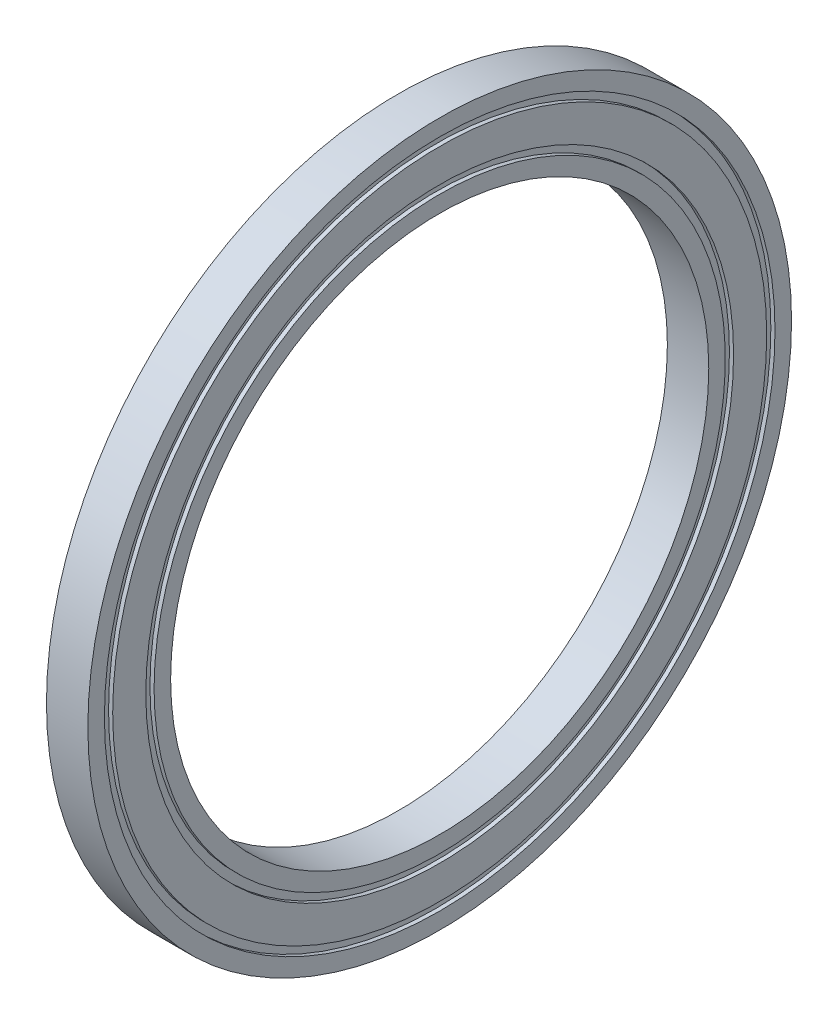
ISO-10303-21;
HEADER;
FILE_DESCRIPTION(('STEP AP214'),'2;1');
FILE_NAME('part.step','',(''),(''),'','','');
FILE_SCHEMA(('AUTOMOTIVE_DESIGN { 1 0 10303 214 1 1 1 1 }'));
ENDSEC;
DATA;
#1=APPLICATION_CONTEXT('core data for automotive mechanical design processes');
#2=APPLICATION_PROTOCOL_DEFINITION('international standard','automotive_design',2000,#1);
#3=PRODUCT_CONTEXT('',#1,'mechanical');
#4=PRODUCT('Part','Part','',(#3));
#5=PRODUCT_RELATED_PRODUCT_CATEGORY('part','',(#4));
#6=PRODUCT_DEFINITION_FORMATION('','',#4);
#7=PRODUCT_DEFINITION_CONTEXT('part definition',#1,'design');
#8=PRODUCT_DEFINITION('design','',#6,#7);
#9=PRODUCT_DEFINITION_SHAPE('','',#8);
#10=(LENGTH_UNIT() NAMED_UNIT(*) SI_UNIT(.MILLI.,.METRE.));
#11=(NAMED_UNIT(*) PLANE_ANGLE_UNIT() SI_UNIT($,.RADIAN.));
#12=(NAMED_UNIT(*) SI_UNIT($,.STERADIAN.) SOLID_ANGLE_UNIT());
#13=UNCERTAINTY_MEASURE_WITH_UNIT(LENGTH_MEASURE(1.E-05),#10,'distance_accuracy_value','');
#14=(GEOMETRIC_REPRESENTATION_CONTEXT(3) GLOBAL_UNCERTAINTY_ASSIGNED_CONTEXT((#13)) GLOBAL_UNIT_ASSIGNED_CONTEXT((#10,
#11,#12)) REPRESENTATION_CONTEXT('',''));
#15=CARTESIAN_POINT('',(0.,0.,0.));
#16=DIRECTION('',(0.,0.,1.));
#17=DIRECTION('',(1.,0.,0.));
#18=AXIS2_PLACEMENT_3D('',#15,#16,#17);
#19=CARTESIAN_POINT('',(2.,40.5,0.));
#20=DIRECTION('',(-1.,0.,0.));
#21=DIRECTION('',(0.,0.,1.));
#22=AXIS2_PLACEMENT_3D('',#19,#20,#21);
#23=PLANE('',#22);
#24=CARTESIAN_POINT('',(2.,0.,0.));
#25=DIRECTION('',(-1.,0.,0.));
#26=DIRECTION('',(0.,0.,1.));
#27=AXIS2_PLACEMENT_3D('',#24,#25,#26);
#28=CIRCLE('',#27,40.5);
#29=CARTESIAN_POINT('',(2.,0.,40.5));
#30=VERTEX_POINT('',#29);
#31=EDGE_CURVE('E10',#30,#30,#28,.T.);
#32=ORIENTED_EDGE('',*,*,#31,.F.);
#33=EDGE_LOOP('',(#32));
#34=FACE_BOUND('',#33,.T.);
#35=CARTESIAN_POINT('',(2.,0.,0.));
#36=DIRECTION('',(-1.,0.,0.));
#37=DIRECTION('',(0.,0.,1.));
#38=AXIS2_PLACEMENT_3D('',#35,#36,#37);
#39=CIRCLE('',#38,39.5);
#40=CARTESIAN_POINT('',(2.,0.,39.5));
#41=VERTEX_POINT('',#40);
#42=EDGE_CURVE('E107',#41,#41,#39,.T.);
#43=ORIENTED_EDGE('',*,*,#42,.T.);
#44=EDGE_LOOP('',(#43));
#45=FACE_BOUND('',#44,.T.);
#46=ADVANCED_FACE('F43',(#34,#45),#23,.F.);
#47=CARTESIAN_POINT('',(0.,0.,0.));
#48=DIRECTION('',(-1.,0.,0.));
#49=DIRECTION('',(0.,0.,1.));
#50=AXIS2_PLACEMENT_3D('',#47,#48,#49);
#51=CYLINDRICAL_SURFACE('',#50,40.5);
#52=CARTESIAN_POINT('',(2.5,0.,0.));
#53=DIRECTION('',(-1.,0.,0.));
#54=DIRECTION('',(0.,0.,1.));
#55=AXIS2_PLACEMENT_3D('',#52,#53,#54);
#56=CIRCLE('',#55,40.5);
#57=CARTESIAN_POINT('',(2.5,0.,40.5));
#58=VERTEX_POINT('',#57);
#59=EDGE_CURVE('E49',#58,#58,#56,.T.);
#60=ORIENTED_EDGE('',*,*,#59,.F.);
#61=EDGE_LOOP('',(#60));
#62=FACE_BOUND('',#61,.T.);
#63=ORIENTED_EDGE('',*,*,#31,.T.);
#64=EDGE_LOOP('',(#63));
#65=FACE_BOUND('',#64,.T.);
#66=ADVANCED_FACE('F216',(#62,#65),#51,.F.);
#67=CARTESIAN_POINT('',(2.5,42.5,0.));
#68=DIRECTION('',(-1.,0.,0.));
#69=DIRECTION('',(0.,0.,1.));
#70=AXIS2_PLACEMENT_3D('',#67,#68,#69);
#71=PLANE('',#70);
#72=CARTESIAN_POINT('',(2.5,0.,0.));
#73=DIRECTION('',(-1.,0.,0.));
#74=DIRECTION('',(0.,0.,1.));
#75=AXIS2_PLACEMENT_3D('',#72,#73,#74);
#76=CIRCLE('',#75,42.5);
#77=CARTESIAN_POINT('',(2.5,0.,42.5));
#78=VERTEX_POINT('',#77);
#79=EDGE_CURVE('E53',#78,#78,#76,.T.);
#80=ORIENTED_EDGE('',*,*,#79,.F.);
#81=EDGE_LOOP('',(#80));
#82=FACE_BOUND('',#81,.T.);
#83=ORIENTED_EDGE('',*,*,#59,.T.);
#84=EDGE_LOOP('',(#83));
#85=FACE_BOUND('',#84,.T.);
#86=ADVANCED_FACE('F211',(#82,#85),#71,.F.);
#87=CARTESIAN_POINT('',(0.,0.,0.));
#88=DIRECTION('',(-1.,0.,0.));
#89=DIRECTION('',(0.,0.,1.));
#90=AXIS2_PLACEMENT_3D('',#87,#88,#89);
#91=CYLINDRICAL_SURFACE('',#90,42.5);
#92=CARTESIAN_POINT('',(-2.5,0.,0.));
#93=DIRECTION('',(-1.,0.,0.));
#94=DIRECTION('',(0.,0.,1.));
#95=AXIS2_PLACEMENT_3D('',#92,#93,#94);
#96=CIRCLE('',#95,42.5);
#97=CARTESIAN_POINT('',(-2.5,0.,42.5));
#98=VERTEX_POINT('',#97);
#99=EDGE_CURVE('E57',#98,#98,#96,.T.);
#100=ORIENTED_EDGE('',*,*,#99,.F.);
#101=EDGE_LOOP('',(#100));
#102=FACE_BOUND('',#101,.T.);
#103=ORIENTED_EDGE('',*,*,#79,.T.);
#104=EDGE_LOOP('',(#103));
#105=FACE_BOUND('',#104,.T.);
#106=ADVANCED_FACE('F205',(#102,#105),#91,.T.);
#107=CARTESIAN_POINT('',(-2.5,42.5,0.));
#108=DIRECTION('',(1.,0.,0.));
#109=DIRECTION('',(0.,0.,-1.));
#110=AXIS2_PLACEMENT_3D('',#107,#108,#109);
#111=PLANE('',#110);
#112=CARTESIAN_POINT('',(-2.5,0.,0.));
#113=DIRECTION('',(-1.,0.,0.));
#114=DIRECTION('',(0.,0.,1.));
#115=AXIS2_PLACEMENT_3D('',#112,#113,#114);
#116=CIRCLE('',#115,40.5);
#117=CARTESIAN_POINT('',(-2.5,0.,40.5));
#118=VERTEX_POINT('',#117);
#119=EDGE_CURVE('E62',#118,#118,#116,.T.);
#120=ORIENTED_EDGE('',*,*,#119,.F.);
#121=EDGE_LOOP('',(#120));
#122=FACE_BOUND('',#121,.T.);
#123=ORIENTED_EDGE('',*,*,#99,.T.);
#124=EDGE_LOOP('',(#123));
#125=FACE_BOUND('',#124,.T.);
#126=ADVANCED_FACE('F199',(#122,#125),#111,.F.);
#127=CARTESIAN_POINT('',(0.,0.,0.));
#128=DIRECTION('',(-1.,0.,0.));
#129=DIRECTION('',(0.,0.,1.));
#130=AXIS2_PLACEMENT_3D('',#127,#128,#129);
#131=CYLINDRICAL_SURFACE('',#130,40.5);
#132=CARTESIAN_POINT('',(-2.,0.,0.));
#133=DIRECTION('',(-1.,0.,0.));
#134=DIRECTION('',(0.,0.,1.));
#135=AXIS2_PLACEMENT_3D('',#132,#133,#134);
#136=CIRCLE('',#135,40.5);
#137=CARTESIAN_POINT('',(-2.,0.,40.5));
#138=VERTEX_POINT('',#137);
#139=EDGE_CURVE('E65',#138,#138,#136,.T.);
#140=ORIENTED_EDGE('',*,*,#139,.F.);
#141=EDGE_LOOP('',(#140));
#142=FACE_BOUND('',#141,.T.);
#143=ORIENTED_EDGE('',*,*,#119,.T.);
#144=EDGE_LOOP('',(#143));
#145=FACE_BOUND('',#144,.T.);
#146=ADVANCED_FACE('F193',(#142,#145),#131,.F.);
#147=CARTESIAN_POINT('',(-2.,40.5,0.));
#148=DIRECTION('',(1.,0.,0.));
#149=DIRECTION('',(0.,0.,-1.));
#150=AXIS2_PLACEMENT_3D('',#147,#148,#149);
#151=PLANE('',#150);
#152=CARTESIAN_POINT('',(-2.,0.,0.));
#153=DIRECTION('',(-1.,0.,0.));
#154=DIRECTION('',(0.,0.,1.));
#155=AXIS2_PLACEMENT_3D('',#152,#153,#154);
#156=CIRCLE('',#155,39.5);
#157=CARTESIAN_POINT('',(-2.,0.,39.5));
#158=VERTEX_POINT('',#157);
#159=EDGE_CURVE('E68',#158,#158,#156,.T.);
#160=ORIENTED_EDGE('',*,*,#159,.F.);
#161=EDGE_LOOP('',(#160));
#162=FACE_BOUND('',#161,.T.);
#163=ORIENTED_EDGE('',*,*,#139,.T.);
#164=EDGE_LOOP('',(#163));
#165=FACE_BOUND('',#164,.T.);
#166=ADVANCED_FACE('F187',(#162,#165),#151,.F.);
#167=CARTESIAN_POINT('',(0.,0.,0.));
#168=DIRECTION('',(-1.,0.,0.));
#169=DIRECTION('',(0.,0.,1.));
#170=AXIS2_PLACEMENT_3D('',#167,#168,#169);
#171=CYLINDRICAL_SURFACE('',#170,39.5);
#172=CARTESIAN_POINT('',(-2.5,0.,0.));
#173=DIRECTION('',(-1.,0.,0.));
#174=DIRECTION('',(0.,0.,1.));
#175=AXIS2_PLACEMENT_3D('',#172,#173,#174);
#176=CIRCLE('',#175,39.5);
#177=CARTESIAN_POINT('',(-2.5,0.,39.5));
#178=VERTEX_POINT('',#177);
#179=EDGE_CURVE('E71',#178,#178,#176,.T.);
#180=ORIENTED_EDGE('',*,*,#179,.F.);
#181=EDGE_LOOP('',(#180));
#182=FACE_BOUND('',#181,.T.);
#183=ORIENTED_EDGE('',*,*,#159,.T.);
#184=EDGE_LOOP('',(#183));
#185=FACE_BOUND('',#184,.T.);
#186=ADVANCED_FACE('F181',(#182,#185),#171,.T.);
#187=CARTESIAN_POINT('',(-2.5,39.5,0.));
#188=DIRECTION('',(1.,0.,0.));
#189=DIRECTION('',(0.,0.,-1.));
#190=AXIS2_PLACEMENT_3D('',#187,#188,#189);
#191=PLANE('',#190);
#192=CARTESIAN_POINT('',(-2.5,0.,0.));
#193=DIRECTION('',(-1.,0.,0.));
#194=DIRECTION('',(0.,0.,1.));
#195=AXIS2_PLACEMENT_3D('',#192,#193,#194);
#196=CIRCLE('',#195,35.5);
#197=CARTESIAN_POINT('',(-2.5,0.,35.5));
#198=VERTEX_POINT('',#197);
#199=EDGE_CURVE('E74',#198,#198,#196,.T.);
#200=ORIENTED_EDGE('',*,*,#199,.F.);
#201=EDGE_LOOP('',(#200));
#202=FACE_BOUND('',#201,.T.);
#203=ORIENTED_EDGE('',*,*,#179,.T.);
#204=EDGE_LOOP('',(#203));
#205=FACE_BOUND('',#204,.T.);
#206=ADVANCED_FACE('F175',(#202,#205),#191,.F.);
#207=CARTESIAN_POINT('',(0.,0.,0.));
#208=DIRECTION('',(-1.,0.,0.));
#209=DIRECTION('',(0.,0.,1.));
#210=AXIS2_PLACEMENT_3D('',#207,#208,#209);
#211=CYLINDRICAL_SURFACE('',#210,35.5);
#212=CARTESIAN_POINT('',(-2.,0.,0.));
#213=DIRECTION('',(-1.,0.,0.));
#214=DIRECTION('',(0.,0.,1.));
#215=AXIS2_PLACEMENT_3D('',#212,#213,#214);
#216=CIRCLE('',#215,35.5);
#217=CARTESIAN_POINT('',(-2.,0.,35.5));
#218=VERTEX_POINT('',#217);
#219=EDGE_CURVE('E77',#218,#218,#216,.T.);
#220=ORIENTED_EDGE('',*,*,#219,.F.);
#221=EDGE_LOOP('',(#220));
#222=FACE_BOUND('',#221,.T.);
#223=ORIENTED_EDGE('',*,*,#199,.T.);
#224=EDGE_LOOP('',(#223));
#225=FACE_BOUND('',#224,.T.);
#226=ADVANCED_FACE('F169',(#222,#225),#211,.F.);
#227=CARTESIAN_POINT('',(-2.,34.5,0.));
#228=DIRECTION('',(1.,0.,0.));
#229=DIRECTION('',(0.,0.,-1.));
#230=AXIS2_PLACEMENT_3D('',#227,#228,#229);
#231=PLANE('',#230);
#232=CARTESIAN_POINT('',(-2.,0.,0.));
#233=DIRECTION('',(-1.,0.,0.));
#234=DIRECTION('',(0.,0.,1.));
#235=AXIS2_PLACEMENT_3D('',#232,#233,#234);
#236=CIRCLE('',#235,34.5);
#237=CARTESIAN_POINT('',(-2.,0.,34.5));
#238=VERTEX_POINT('',#237);
#239=EDGE_CURVE('E80',#238,#238,#236,.T.);
#240=ORIENTED_EDGE('',*,*,#239,.F.);
#241=EDGE_LOOP('',(#240));
#242=FACE_BOUND('',#241,.T.);
#243=ORIENTED_EDGE('',*,*,#219,.T.);
#244=EDGE_LOOP('',(#243));
#245=FACE_BOUND('',#244,.T.);
#246=ADVANCED_FACE('F163',(#242,#245),#231,.F.);
#247=CARTESIAN_POINT('',(0.,0.,0.));
#248=DIRECTION('',(-1.,0.,0.));
#249=DIRECTION('',(0.,0.,1.));
#250=AXIS2_PLACEMENT_3D('',#247,#248,#249);
#251=CYLINDRICAL_SURFACE('',#250,34.5);
#252=CARTESIAN_POINT('',(-2.5,0.,0.));
#253=DIRECTION('',(-1.,0.,0.));
#254=DIRECTION('',(0.,0.,1.));
#255=AXIS2_PLACEMENT_3D('',#252,#253,#254);
#256=CIRCLE('',#255,34.5);
#257=CARTESIAN_POINT('',(-2.5,0.,34.5));
#258=VERTEX_POINT('',#257);
#259=EDGE_CURVE('E83',#258,#258,#256,.T.);
#260=ORIENTED_EDGE('',*,*,#259,.F.);
#261=EDGE_LOOP('',(#260));
#262=FACE_BOUND('',#261,.T.);
#263=ORIENTED_EDGE('',*,*,#239,.T.);
#264=EDGE_LOOP('',(#263));
#265=FACE_BOUND('',#264,.T.);
#266=ADVANCED_FACE('F157',(#262,#265),#251,.T.);
#267=CARTESIAN_POINT('',(-2.5,32.5,0.));
#268=DIRECTION('',(1.,0.,0.));
#269=DIRECTION('',(0.,0.,-1.));
#270=AXIS2_PLACEMENT_3D('',#267,#268,#269);
#271=PLANE('',#270);
#272=CARTESIAN_POINT('',(-2.5,0.,0.));
#273=DIRECTION('',(-1.,0.,0.));
#274=DIRECTION('',(0.,0.,1.));
#275=AXIS2_PLACEMENT_3D('',#272,#273,#274);
#276=CIRCLE('',#275,32.5);
#277=CARTESIAN_POINT('',(-2.5,0.,32.5));
#278=VERTEX_POINT('',#277);
#279=EDGE_CURVE('E86',#278,#278,#276,.T.);
#280=ORIENTED_EDGE('',*,*,#279,.F.);
#281=EDGE_LOOP('',(#280));
#282=FACE_BOUND('',#281,.T.);
#283=ORIENTED_EDGE('',*,*,#259,.T.);
#284=EDGE_LOOP('',(#283));
#285=FACE_BOUND('',#284,.T.);
#286=ADVANCED_FACE('F151',(#282,#285),#271,.F.);
#287=CARTESIAN_POINT('',(0.,0.,0.));
#288=DIRECTION('',(-1.,0.,0.));
#289=DIRECTION('',(0.,0.,1.));
#290=AXIS2_PLACEMENT_3D('',#287,#288,#289);
#291=CYLINDRICAL_SURFACE('',#290,32.5);
#292=CARTESIAN_POINT('',(2.5,0.,0.));
#293=DIRECTION('',(-1.,0.,0.));
#294=DIRECTION('',(0.,0.,1.));
#295=AXIS2_PLACEMENT_3D('',#292,#293,#294);
#296=CIRCLE('',#295,32.5);
#297=CARTESIAN_POINT('',(2.5,0.,32.5));
#298=VERTEX_POINT('',#297);
#299=EDGE_CURVE('E89',#298,#298,#296,.T.);
#300=ORIENTED_EDGE('',*,*,#299,.F.);
#301=EDGE_LOOP('',(#300));
#302=FACE_BOUND('',#301,.T.);
#303=ORIENTED_EDGE('',*,*,#279,.T.);
#304=EDGE_LOOP('',(#303));
#305=FACE_BOUND('',#304,.T.);
#306=ADVANCED_FACE('F145',(#302,#305),#291,.F.);
#307=CARTESIAN_POINT('',(2.5,32.5,0.));
#308=DIRECTION('',(-1.,0.,0.));
#309=DIRECTION('',(0.,0.,1.));
#310=AXIS2_PLACEMENT_3D('',#307,#308,#309);
#311=PLANE('',#310);
#312=CARTESIAN_POINT('',(2.5,0.,0.));
#313=DIRECTION('',(-1.,0.,0.));
#314=DIRECTION('',(0.,0.,1.));
#315=AXIS2_PLACEMENT_3D('',#312,#313,#314);
#316=CIRCLE('',#315,34.5);
#317=CARTESIAN_POINT('',(2.5,0.,34.5));
#318=VERTEX_POINT('',#317);
#319=EDGE_CURVE('E92',#318,#318,#316,.T.);
#320=ORIENTED_EDGE('',*,*,#319,.F.);
#321=EDGE_LOOP('',(#320));
#322=FACE_BOUND('',#321,.T.);
#323=ORIENTED_EDGE('',*,*,#299,.T.);
#324=EDGE_LOOP('',(#323));
#325=FACE_BOUND('',#324,.T.);
#326=ADVANCED_FACE('F139',(#322,#325),#311,.F.);
#327=CARTESIAN_POINT('',(0.,0.,0.));
#328=DIRECTION('',(-1.,0.,0.));
#329=DIRECTION('',(0.,0.,1.));
#330=AXIS2_PLACEMENT_3D('',#327,#328,#329);
#331=CYLINDRICAL_SURFACE('',#330,34.5);
#332=CARTESIAN_POINT('',(2.,0.,0.));
#333=DIRECTION('',(-1.,0.,0.));
#334=DIRECTION('',(0.,0.,1.));
#335=AXIS2_PLACEMENT_3D('',#332,#333,#334);
#336=CIRCLE('',#335,34.5);
#337=CARTESIAN_POINT('',(2.,0.,34.5));
#338=VERTEX_POINT('',#337);
#339=EDGE_CURVE('E95',#338,#338,#336,.T.);
#340=ORIENTED_EDGE('',*,*,#339,.F.);
#341=EDGE_LOOP('',(#340));
#342=FACE_BOUND('',#341,.T.);
#343=ORIENTED_EDGE('',*,*,#319,.T.);
#344=EDGE_LOOP('',(#343));
#345=FACE_BOUND('',#344,.T.);
#346=ADVANCED_FACE('F133',(#342,#345),#331,.T.);
#347=CARTESIAN_POINT('',(2.,34.5,0.));
#348=DIRECTION('',(-1.,0.,0.));
#349=DIRECTION('',(0.,0.,1.));
#350=AXIS2_PLACEMENT_3D('',#347,#348,#349);
#351=PLANE('',#350);
#352=CARTESIAN_POINT('',(2.,0.,0.));
#353=DIRECTION('',(-1.,0.,0.));
#354=DIRECTION('',(0.,0.,1.));
#355=AXIS2_PLACEMENT_3D('',#352,#353,#354);
#356=CIRCLE('',#355,35.5);
#357=CARTESIAN_POINT('',(2.,0.,35.5));
#358=VERTEX_POINT('',#357);
#359=EDGE_CURVE('E98',#358,#358,#356,.T.);
#360=ORIENTED_EDGE('',*,*,#359,.F.);
#361=EDGE_LOOP('',(#360));
#362=FACE_BOUND('',#361,.T.);
#363=ORIENTED_EDGE('',*,*,#339,.T.);
#364=EDGE_LOOP('',(#363));
#365=FACE_BOUND('',#364,.T.);
#366=ADVANCED_FACE('F127',(#362,#365),#351,.F.);
#367=CARTESIAN_POINT('',(0.,0.,0.));
#368=DIRECTION('',(-1.,0.,0.));
#369=DIRECTION('',(0.,0.,1.));
#370=AXIS2_PLACEMENT_3D('',#367,#368,#369);
#371=CYLINDRICAL_SURFACE('',#370,35.5);
#372=CARTESIAN_POINT('',(2.5,0.,0.));
#373=DIRECTION('',(-1.,0.,0.));
#374=DIRECTION('',(0.,0.,1.));
#375=AXIS2_PLACEMENT_3D('',#372,#373,#374);
#376=CIRCLE('',#375,35.5);
#377=CARTESIAN_POINT('',(2.5,0.,35.5));
#378=VERTEX_POINT('',#377);
#379=EDGE_CURVE('E101',#378,#378,#376,.T.);
#380=ORIENTED_EDGE('',*,*,#379,.F.);
#381=EDGE_LOOP('',(#380));
#382=FACE_BOUND('',#381,.T.);
#383=ORIENTED_EDGE('',*,*,#359,.T.);
#384=EDGE_LOOP('',(#383));
#385=FACE_BOUND('',#384,.T.);
#386=ADVANCED_FACE('F121',(#382,#385),#371,.F.);
#387=CARTESIAN_POINT('',(2.5,39.5,0.));
#388=DIRECTION('',(-1.,0.,0.));
#389=DIRECTION('',(0.,0.,1.));
#390=AXIS2_PLACEMENT_3D('',#387,#388,#389);
#391=PLANE('',#390);
#392=CARTESIAN_POINT('',(2.5,0.,0.));
#393=DIRECTION('',(-1.,0.,0.));
#394=DIRECTION('',(0.,0.,1.));
#395=AXIS2_PLACEMENT_3D('',#392,#393,#394);
#396=CIRCLE('',#395,39.5);
#397=CARTESIAN_POINT('',(2.5,0.,39.5));
#398=VERTEX_POINT('',#397);
#399=EDGE_CURVE('E104',#398,#398,#396,.T.);
#400=ORIENTED_EDGE('',*,*,#399,.F.);
#401=EDGE_LOOP('',(#400));
#402=FACE_BOUND('',#401,.T.);
#403=ORIENTED_EDGE('',*,*,#379,.T.);
#404=EDGE_LOOP('',(#403));
#405=FACE_BOUND('',#404,.T.);
#406=ADVANCED_FACE('F115',(#402,#405),#391,.F.);
#407=CARTESIAN_POINT('',(0.,0.,0.));
#408=DIRECTION('',(-1.,0.,0.));
#409=DIRECTION('',(0.,0.,1.));
#410=AXIS2_PLACEMENT_3D('',#407,#408,#409);
#411=CYLINDRICAL_SURFACE('',#410,39.5);
#412=ORIENTED_EDGE('',*,*,#42,.F.);
#413=EDGE_LOOP('',(#412));
#414=FACE_BOUND('',#413,.T.);
#415=ORIENTED_EDGE('',*,*,#399,.T.);
#416=EDGE_LOOP('',(#415));
#417=FACE_BOUND('',#416,.T.);
#418=ADVANCED_FACE('F112',(#414,#417),#411,.T.);
#419=CLOSED_SHELL('',(#46,#66,#86,#106,#126,#146,#166,#186,#206,#226,#246,#266,#286,#306,#326,
#346,#366,#386,#406,#418));
#420=MANIFOLD_SOLID_BREP('B2',#419);
#421=ADVANCED_BREP_SHAPE_REPRESENTATION('',(#18,#420),#14);
#422=SHAPE_DEFINITION_REPRESENTATION(#9,#421);
ENDSEC;
END-ISO-10303-21;
